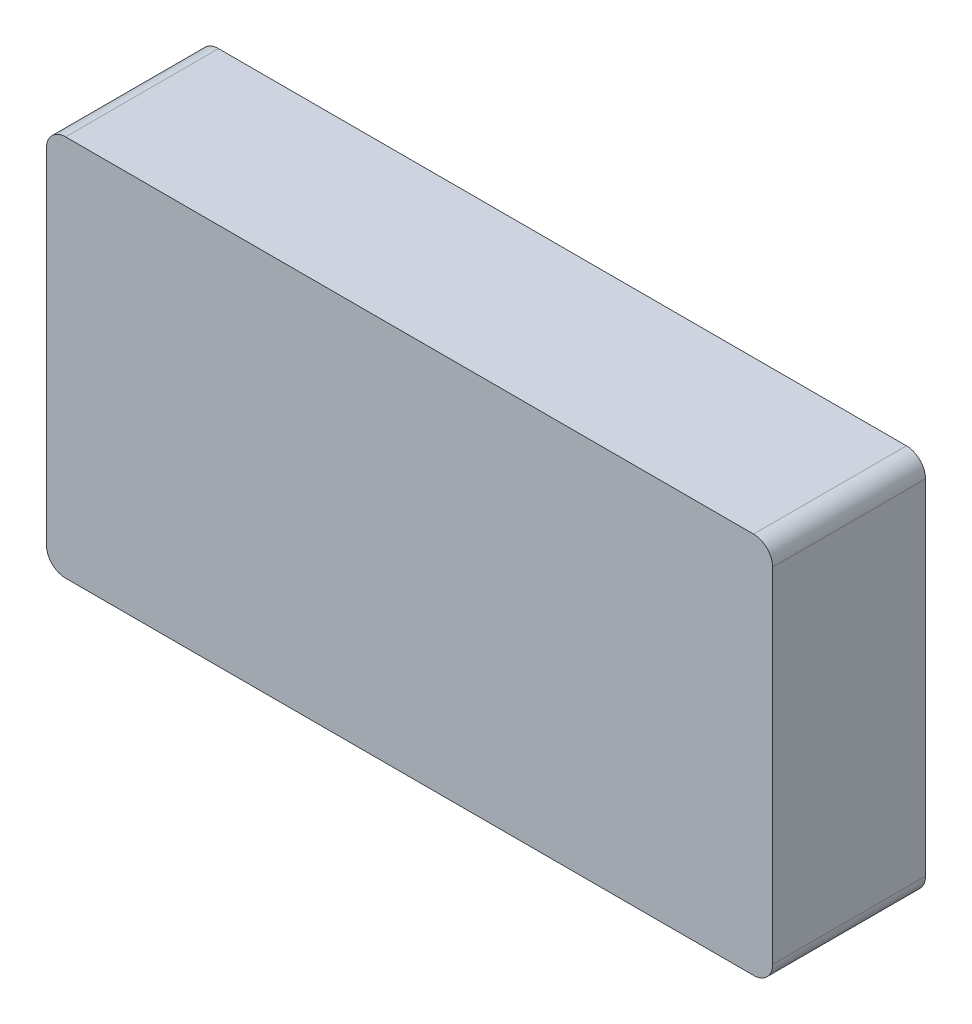
ISO-10303-21;
HEADER;
FILE_DESCRIPTION(('STEP AP214'),'2;1');
FILE_NAME('part.step','',(''),(''),'','','');
FILE_SCHEMA(('AUTOMOTIVE_DESIGN { 1 0 10303 214 1 1 1 1 }'));
ENDSEC;
DATA;
#1=APPLICATION_CONTEXT('core data for automotive mechanical design processes');
#2=APPLICATION_PROTOCOL_DEFINITION('international standard','automotive_design',2000,#1);
#3=PRODUCT_CONTEXT('',#1,'mechanical');
#4=PRODUCT('Part','Part','',(#3));
#5=PRODUCT_RELATED_PRODUCT_CATEGORY('part','',(#4));
#6=PRODUCT_DEFINITION_FORMATION('','',#4);
#7=PRODUCT_DEFINITION_CONTEXT('part definition',#1,'design');
#8=PRODUCT_DEFINITION('design','',#6,#7);
#9=PRODUCT_DEFINITION_SHAPE('','',#8);
#10=(LENGTH_UNIT() NAMED_UNIT(*) SI_UNIT(.MILLI.,.METRE.));
#11=(NAMED_UNIT(*) PLANE_ANGLE_UNIT() SI_UNIT($,.RADIAN.));
#12=(NAMED_UNIT(*) SI_UNIT($,.STERADIAN.) SOLID_ANGLE_UNIT());
#13=UNCERTAINTY_MEASURE_WITH_UNIT(LENGTH_MEASURE(1.E-05),#10,'distance_accuracy_value','');
#14=(GEOMETRIC_REPRESENTATION_CONTEXT(3) GLOBAL_UNCERTAINTY_ASSIGNED_CONTEXT((#13)) GLOBAL_UNIT_ASSIGNED_CONTEXT((#10,
#11,#12)) REPRESENTATION_CONTEXT('',''));
#15=CARTESIAN_POINT('',(0.,0.,0.));
#16=DIRECTION('',(0.,0.,1.));
#17=DIRECTION('',(1.,0.,0.));
#18=AXIS2_PLACEMENT_3D('',#15,#16,#17);
#19=CARTESIAN_POINT('',(90.,45.,40.));
#20=DIRECTION('',(0.,0.,-1.));
#21=DIRECTION('',(-1.,0.,0.));
#22=AXIS2_PLACEMENT_3D('',#19,#20,#21);
#23=PLANE('',#22);
#24=CARTESIAN_POINT('',(90.,45.,40.));
#25=DIRECTION('',(0.,0.,1.));
#26=DIRECTION('',(-1.,0.,0.));
#27=AXIS2_PLACEMENT_3D('',#24,#25,#26);
#28=CIRCLE('',#27,5.);
#29=CARTESIAN_POINT('',(95.,45.,40.));
#30=VERTEX_POINT('',#29);
#31=CARTESIAN_POINT('',(89.9999999999999,50.,40.));
#32=VERTEX_POINT('',#31);
#33=EDGE_CURVE('E189',#30,#32,#28,.T.);
#34=ORIENTED_EDGE('',*,*,#33,.T.);
#35=DIRECTION('',(-1.,0.,0.));
#36=VECTOR('',#35,1.);
#37=CARTESIAN_POINT('',(-90.,50.,40.));
#38=LINE('',#37,#36);
#39=CARTESIAN_POINT('',(-90.,50.,40.));
#40=VERTEX_POINT('',#39);
#41=EDGE_CURVE('E119',#32,#40,#38,.T.);
#42=ORIENTED_EDGE('',*,*,#41,.T.);
#43=CARTESIAN_POINT('',(-90.,45.,40.));
#44=DIRECTION('',(0.,0.,1.));
#45=DIRECTION('',(1.,0.,0.));
#46=AXIS2_PLACEMENT_3D('',#43,#44,#45);
#47=CIRCLE('',#46,5.);
#48=CARTESIAN_POINT('',(-95.,45.,40.));
#49=VERTEX_POINT('',#48);
#50=EDGE_CURVE('E210',#40,#49,#47,.T.);
#51=ORIENTED_EDGE('',*,*,#50,.T.);
#52=DIRECTION('',(0.,-1.,0.));
#53=VECTOR('',#52,1.);
#54=CARTESIAN_POINT('',(-95.,45.,40.));
#55=LINE('',#54,#53);
#56=CARTESIAN_POINT('',(-95.,-45.,40.));
#57=VERTEX_POINT('',#56);
#58=EDGE_CURVE('E223',#49,#57,#55,.T.);
#59=ORIENTED_EDGE('',*,*,#58,.T.);
#60=CARTESIAN_POINT('',(-90.,-45.,40.));
#61=DIRECTION('',(0.,0.,1.));
#62=DIRECTION('',(1.,0.,0.));
#63=AXIS2_PLACEMENT_3D('',#60,#61,#62);
#64=CIRCLE('',#63,5.);
#65=CARTESIAN_POINT('',(-90.,-50.,40.));
#66=VERTEX_POINT('',#65);
#67=EDGE_CURVE('E140',#57,#66,#64,.T.);
#68=ORIENTED_EDGE('',*,*,#67,.T.);
#69=DIRECTION('',(1.,0.,0.));
#70=VECTOR('',#69,1.);
#71=CARTESIAN_POINT('',(-90.,-50.,40.));
#72=LINE('',#71,#70);
#73=CARTESIAN_POINT('',(90.,-50.,40.));
#74=VERTEX_POINT('',#73);
#75=EDGE_CURVE('E134',#66,#74,#72,.T.);
#76=ORIENTED_EDGE('',*,*,#75,.T.);
#77=CARTESIAN_POINT('',(90.,-45.,40.));
#78=DIRECTION('',(0.,0.,1.));
#79=DIRECTION('',(1.,0.,0.));
#80=AXIS2_PLACEMENT_3D('',#77,#78,#79);
#81=CIRCLE('',#80,5.);
#82=CARTESIAN_POINT('',(95.,-45.,40.));
#83=VERTEX_POINT('',#82);
#84=EDGE_CURVE('E137',#74,#83,#81,.T.);
#85=ORIENTED_EDGE('',*,*,#84,.T.);
#86=DIRECTION('',(0.,1.,0.));
#87=VECTOR('',#86,1.);
#88=CARTESIAN_POINT('',(95.,45.,40.));
#89=LINE('',#88,#87);
#90=EDGE_CURVE('E78',#83,#30,#89,.T.);
#91=ORIENTED_EDGE('',*,*,#90,.T.);
#92=EDGE_LOOP('',(#34,#42,#51,#59,#68,#76,#85,#91));
#93=FACE_BOUND('',#92,.T.);
#94=ADVANCED_FACE('F52',(#93),#23,.F.);
#95=CARTESIAN_POINT('',(90.,45.,40.));
#96=DIRECTION('',(0.,0.,-1.));
#97=DIRECTION('',(-1.,0.,0.));
#98=AXIS2_PLACEMENT_3D('',#95,#96,#97);
#99=CYLINDRICAL_SURFACE('',#98,5.);
#100=CARTESIAN_POINT('',(90.,45.,0.));
#101=DIRECTION('',(0.,0.,1.));
#102=DIRECTION('',(-1.,0.,0.));
#103=AXIS2_PLACEMENT_3D('',#100,#101,#102);
#104=CIRCLE('',#103,5.);
#105=CARTESIAN_POINT('',(95.,45.,0.));
#106=VERTEX_POINT('',#105);
#107=CARTESIAN_POINT('',(89.9999999999999,50.,0.));
#108=VERTEX_POINT('',#107);
#109=EDGE_CURVE('E165',#106,#108,#104,.T.);
#110=ORIENTED_EDGE('',*,*,#109,.T.);
#111=DIRECTION('',(0.,0.,-1.));
#112=VECTOR('',#111,1.);
#113=CARTESIAN_POINT('',(89.9999999999999,50.,40.));
#114=LINE('',#113,#112);
#115=EDGE_CURVE('E11',#32,#108,#114,.T.);
#116=ORIENTED_EDGE('',*,*,#115,.F.);
#117=ORIENTED_EDGE('',*,*,#33,.F.);
#118=DIRECTION('',(0.,0.,-1.));
#119=VECTOR('',#118,1.);
#120=CARTESIAN_POINT('',(95.,45.,40.));
#121=LINE('',#120,#119);
#122=EDGE_CURVE('E161',#30,#106,#121,.T.);
#123=ORIENTED_EDGE('',*,*,#122,.T.);
#124=EDGE_LOOP('',(#110,#116,#117,#123));
#125=FACE_BOUND('',#124,.T.);
#126=ADVANCED_FACE('F54',(#125),#99,.T.);
#127=CARTESIAN_POINT('',(-90.,50.,40.));
#128=DIRECTION('',(0.,-1.,0.));
#129=DIRECTION('',(0.,0.,-1.));
#130=AXIS2_PLACEMENT_3D('',#127,#128,#129);
#131=PLANE('',#130);
#132=DIRECTION('',(-1.,0.,0.));
#133=VECTOR('',#132,1.);
#134=CARTESIAN_POINT('',(-90.,50.,0.));
#135=LINE('',#134,#133);
#136=CARTESIAN_POINT('',(-90.,50.,0.));
#137=VERTEX_POINT('',#136);
#138=EDGE_CURVE('E169',#108,#137,#135,.T.);
#139=ORIENTED_EDGE('',*,*,#138,.T.);
#140=DIRECTION('',(0.,0.,-1.));
#141=VECTOR('',#140,1.);
#142=CARTESIAN_POINT('',(-90.,50.,40.));
#143=LINE('',#142,#141);
#144=EDGE_CURVE('E62',#40,#137,#143,.T.);
#145=ORIENTED_EDGE('',*,*,#144,.F.);
#146=ORIENTED_EDGE('',*,*,#41,.F.);
#147=ORIENTED_EDGE('',*,*,#115,.T.);
#148=EDGE_LOOP('',(#139,#145,#146,#147));
#149=FACE_BOUND('',#148,.T.);
#150=ADVANCED_FACE('F419',(#149),#131,.F.);
#151=CARTESIAN_POINT('',(-90.,45.,40.));
#152=DIRECTION('',(0.,0.,-1.));
#153=DIRECTION('',(-1.,0.,0.));
#154=AXIS2_PLACEMENT_3D('',#151,#152,#153);
#155=CYLINDRICAL_SURFACE('',#154,5.);
#156=CARTESIAN_POINT('',(-90.,45.,0.));
#157=DIRECTION('',(0.,0.,1.));
#158=DIRECTION('',(1.,0.,0.));
#159=AXIS2_PLACEMENT_3D('',#156,#157,#158);
#160=CIRCLE('',#159,5.);
#161=CARTESIAN_POINT('',(-95.,45.,0.));
#162=VERTEX_POINT('',#161);
#163=EDGE_CURVE('E173',#137,#162,#160,.T.);
#164=ORIENTED_EDGE('',*,*,#163,.T.);
#165=DIRECTION('',(0.,0.,-1.));
#166=VECTOR('',#165,1.);
#167=CARTESIAN_POINT('',(-95.,45.,40.));
#168=LINE('',#167,#166);
#169=EDGE_CURVE('E200',#49,#162,#168,.T.);
#170=ORIENTED_EDGE('',*,*,#169,.F.);
#171=ORIENTED_EDGE('',*,*,#50,.F.);
#172=ORIENTED_EDGE('',*,*,#144,.T.);
#173=EDGE_LOOP('',(#164,#170,#171,#172));
#174=FACE_BOUND('',#173,.T.);
#175=ADVANCED_FACE('F208',(#174),#155,.T.);
#176=CARTESIAN_POINT('',(-95.,45.,40.));
#177=DIRECTION('',(1.,0.,0.));
#178=DIRECTION('',(0.,1.,0.));
#179=AXIS2_PLACEMENT_3D('',#176,#177,#178);
#180=PLANE('',#179);
#181=DIRECTION('',(0.,-1.,0.));
#182=VECTOR('',#181,1.);
#183=CARTESIAN_POINT('',(-95.,45.,0.));
#184=LINE('',#183,#182);
#185=CARTESIAN_POINT('',(-95.,-45.,0.));
#186=VERTEX_POINT('',#185);
#187=EDGE_CURVE('E176',#162,#186,#184,.T.);
#188=ORIENTED_EDGE('',*,*,#187,.T.);
#189=DIRECTION('',(0.,0.,-1.));
#190=VECTOR('',#189,1.);
#191=CARTESIAN_POINT('',(-95.,-45.,40.));
#192=LINE('',#191,#190);
#193=EDGE_CURVE('E196',#57,#186,#192,.T.);
#194=ORIENTED_EDGE('',*,*,#193,.F.);
#195=ORIENTED_EDGE('',*,*,#58,.F.);
#196=ORIENTED_EDGE('',*,*,#169,.T.);
#197=EDGE_LOOP('',(#188,#194,#195,#196));
#198=FACE_BOUND('',#197,.T.);
#199=ADVANCED_FACE('F218',(#198),#180,.F.);
#200=CARTESIAN_POINT('',(-90.,-45.,40.));
#201=DIRECTION('',(0.,0.,-1.));
#202=DIRECTION('',(-1.,0.,0.));
#203=AXIS2_PLACEMENT_3D('',#200,#201,#202);
#204=CYLINDRICAL_SURFACE('',#203,5.);
#205=CARTESIAN_POINT('',(-90.,-45.,0.));
#206=DIRECTION('',(0.,0.,1.));
#207=DIRECTION('',(1.,0.,0.));
#208=AXIS2_PLACEMENT_3D('',#205,#206,#207);
#209=CIRCLE('',#208,5.);
#210=CARTESIAN_POINT('',(-90.,-50.,0.));
#211=VERTEX_POINT('',#210);
#212=EDGE_CURVE('E179',#186,#211,#209,.T.);
#213=ORIENTED_EDGE('',*,*,#212,.T.);
#214=DIRECTION('',(0.,0.,-1.));
#215=VECTOR('',#214,1.);
#216=CARTESIAN_POINT('',(-90.,-50.,40.));
#217=LINE('',#216,#215);
#218=EDGE_CURVE('E154',#66,#211,#217,.T.);
#219=ORIENTED_EDGE('',*,*,#218,.F.);
#220=ORIENTED_EDGE('',*,*,#67,.F.);
#221=ORIENTED_EDGE('',*,*,#193,.T.);
#222=EDGE_LOOP('',(#213,#219,#220,#221));
#223=FACE_BOUND('',#222,.T.);
#224=ADVANCED_FACE('F221',(#223),#204,.T.);
#225=CARTESIAN_POINT('',(-90.,-50.,40.));
#226=DIRECTION('',(0.,1.,0.));
#227=DIRECTION('',(0.,0.,1.));
#228=AXIS2_PLACEMENT_3D('',#225,#226,#227);
#229=PLANE('',#228);
#230=DIRECTION('',(1.,0.,0.));
#231=VECTOR('',#230,1.);
#232=CARTESIAN_POINT('',(-90.,-50.,0.));
#233=LINE('',#232,#231);
#234=CARTESIAN_POINT('',(90.,-50.,0.));
#235=VERTEX_POINT('',#234);
#236=EDGE_CURVE('E150',#211,#235,#233,.T.);
#237=ORIENTED_EDGE('',*,*,#236,.T.);
#238=DIRECTION('',(0.,0.,-1.));
#239=VECTOR('',#238,1.);
#240=CARTESIAN_POINT('',(90.,-50.,40.));
#241=LINE('',#240,#239);
#242=EDGE_CURVE('E147',#74,#235,#241,.T.);
#243=ORIENTED_EDGE('',*,*,#242,.F.);
#244=ORIENTED_EDGE('',*,*,#75,.F.);
#245=ORIENTED_EDGE('',*,*,#218,.T.);
#246=EDGE_LOOP('',(#237,#243,#244,#245));
#247=FACE_BOUND('',#246,.T.);
#248=ADVANCED_FACE('F148',(#247),#229,.F.);
#249=CARTESIAN_POINT('',(90.,-45.,40.));
#250=DIRECTION('',(0.,0.,-1.));
#251=DIRECTION('',(-1.,0.,0.));
#252=AXIS2_PLACEMENT_3D('',#249,#250,#251);
#253=CYLINDRICAL_SURFACE('',#252,5.);
#254=CARTESIAN_POINT('',(90.,-45.,0.));
#255=DIRECTION('',(0.,0.,1.));
#256=DIRECTION('',(1.,0.,0.));
#257=AXIS2_PLACEMENT_3D('',#254,#255,#256);
#258=CIRCLE('',#257,5.);
#259=CARTESIAN_POINT('',(95.,-45.,0.));
#260=VERTEX_POINT('',#259);
#261=EDGE_CURVE('E184',#235,#260,#258,.T.);
#262=ORIENTED_EDGE('',*,*,#261,.T.);
#263=DIRECTION('',(0.,0.,-1.));
#264=VECTOR('',#263,1.);
#265=CARTESIAN_POINT('',(95.,-45.,40.));
#266=LINE('',#265,#264);
#267=EDGE_CURVE('E155',#83,#260,#266,.T.);
#268=ORIENTED_EDGE('',*,*,#267,.F.);
#269=ORIENTED_EDGE('',*,*,#84,.F.);
#270=ORIENTED_EDGE('',*,*,#242,.T.);
#271=EDGE_LOOP('',(#262,#268,#269,#270));
#272=FACE_BOUND('',#271,.T.);
#273=ADVANCED_FACE('F157',(#272),#253,.T.);
#274=CARTESIAN_POINT('',(95.,45.,40.));
#275=DIRECTION('',(-1.,0.,0.));
#276=DIRECTION('',(0.,-1.,0.));
#277=AXIS2_PLACEMENT_3D('',#274,#275,#276);
#278=PLANE('',#277);
#279=DIRECTION('',(0.,1.,0.));
#280=VECTOR('',#279,1.);
#281=CARTESIAN_POINT('',(95.,45.,0.));
#282=LINE('',#281,#280);
#283=EDGE_CURVE('E111',#260,#106,#282,.T.);
#284=ORIENTED_EDGE('',*,*,#283,.T.);
#285=ORIENTED_EDGE('',*,*,#122,.F.);
#286=ORIENTED_EDGE('',*,*,#90,.F.);
#287=ORIENTED_EDGE('',*,*,#267,.T.);
#288=EDGE_LOOP('',(#284,#285,#286,#287));
#289=FACE_BOUND('',#288,.T.);
#290=ADVANCED_FACE('F407',(#289),#278,.F.);
#291=CARTESIAN_POINT('',(90.,45.,0.));
#292=DIRECTION('',(0.,0.,-1.));
#293=DIRECTION('',(-1.,0.,0.));
#294=AXIS2_PLACEMENT_3D('',#291,#292,#293);
#295=PLANE('',#294);
#296=ORIENTED_EDGE('',*,*,#109,.F.);
#297=ORIENTED_EDGE('',*,*,#283,.F.);
#298=ORIENTED_EDGE('',*,*,#261,.F.);
#299=ORIENTED_EDGE('',*,*,#236,.F.);
#300=ORIENTED_EDGE('',*,*,#212,.F.);
#301=ORIENTED_EDGE('',*,*,#187,.F.);
#302=ORIENTED_EDGE('',*,*,#163,.F.);
#303=ORIENTED_EDGE('',*,*,#138,.F.);
#304=EDGE_LOOP('',(#296,#297,#298,#299,#300,#301,#302,#303));
#305=FACE_BOUND('',#304,.T.);
#306=ADVANCED_FACE('F214',(#305),#295,.T.);
#307=CLOSED_SHELL('',(#94,#126,#150,#175,#199,#224,#248,#273,#290,#306));
#308=CARTESIAN_POINT('',(90.,45.,3.));
#309=DIRECTION('',(0.,0.,-1.));
#310=DIRECTION('',(-1.,0.,0.));
#311=AXIS2_PLACEMENT_3D('',#308,#309,#310);
#312=PLANE('',#311);
#313=CARTESIAN_POINT('',(90.,45.,3.));
#314=DIRECTION('',(0.,0.,-1.));
#315=DIRECTION('',(-1.,0.,0.));
#316=AXIS2_PLACEMENT_3D('',#313,#314,#315);
#317=CIRCLE('',#316,2.);
#318=CARTESIAN_POINT('',(92.,45.,3.));
#319=VERTEX_POINT('',#318);
#320=CARTESIAN_POINT('',(89.9999999999999,47.,3.));
#321=VERTEX_POINT('',#320);
#322=EDGE_CURVE('E286',#319,#321,#317,.F.);
#323=ORIENTED_EDGE('',*,*,#322,.T.);
#324=DIRECTION('',(-1.,0.,0.));
#325=VECTOR('',#324,1.);
#326=CARTESIAN_POINT('',(90.,47.,3.));
#327=LINE('',#326,#325);
#328=CARTESIAN_POINT('',(-90.,47.,3.));
#329=VERTEX_POINT('',#328);
#330=EDGE_CURVE('E279',#321,#329,#327,.T.);
#331=ORIENTED_EDGE('',*,*,#330,.T.);
#332=CARTESIAN_POINT('',(-90.,45.,3.));
#333=DIRECTION('',(0.,0.,-1.));
#334=DIRECTION('',(-1.,0.,0.));
#335=AXIS2_PLACEMENT_3D('',#332,#333,#334);
#336=CIRCLE('',#335,2.);
#337=CARTESIAN_POINT('',(-92.,45.,3.));
#338=VERTEX_POINT('',#337);
#339=EDGE_CURVE('E271',#329,#338,#336,.F.);
#340=ORIENTED_EDGE('',*,*,#339,.T.);
#341=DIRECTION('',(0.,-1.,0.));
#342=VECTOR('',#341,1.);
#343=CARTESIAN_POINT('',(-92.,45.,3.));
#344=LINE('',#343,#342);
#345=CARTESIAN_POINT('',(-92.,-45.,3.));
#346=VERTEX_POINT('',#345);
#347=EDGE_CURVE('E263',#338,#346,#344,.T.);
#348=ORIENTED_EDGE('',*,*,#347,.T.);
#349=CARTESIAN_POINT('',(-90.,-45.,3.));
#350=DIRECTION('',(0.,0.,-1.));
#351=DIRECTION('',(-1.,0.,0.));
#352=AXIS2_PLACEMENT_3D('',#349,#350,#351);
#353=CIRCLE('',#352,2.);
#354=CARTESIAN_POINT('',(-90.,-47.,3.));
#355=VERTEX_POINT('',#354);
#356=EDGE_CURVE('E255',#346,#355,#353,.F.);
#357=ORIENTED_EDGE('',*,*,#356,.T.);
#358=DIRECTION('',(1.,0.,0.));
#359=VECTOR('',#358,1.);
#360=CARTESIAN_POINT('',(90.,-47.,3.));
#361=LINE('',#360,#359);
#362=CARTESIAN_POINT('',(90.,-47.,3.));
#363=VERTEX_POINT('',#362);
#364=EDGE_CURVE('E247',#355,#363,#361,.T.);
#365=ORIENTED_EDGE('',*,*,#364,.T.);
#366=CARTESIAN_POINT('',(90.,-45.,3.));
#367=DIRECTION('',(0.,0.,-1.));
#368=DIRECTION('',(-1.,0.,0.));
#369=AXIS2_PLACEMENT_3D('',#366,#367,#368);
#370=CIRCLE('',#369,2.);
#371=CARTESIAN_POINT('',(92.,-45.,3.));
#372=VERTEX_POINT('',#371);
#373=EDGE_CURVE('E238',#363,#372,#370,.F.);
#374=ORIENTED_EDGE('',*,*,#373,.T.);
#375=DIRECTION('',(0.,1.,0.));
#376=VECTOR('',#375,1.);
#377=CARTESIAN_POINT('',(92.,45.,3.));
#378=LINE('',#377,#376);
#379=EDGE_CURVE('E233',#372,#319,#378,.T.);
#380=ORIENTED_EDGE('',*,*,#379,.T.);
#381=EDGE_LOOP('',(#323,#331,#340,#348,#357,#365,#374,#380));
#382=FACE_BOUND('',#381,.T.);
#383=ADVANCED_FACE('F342',(#382),#312,.F.);
#384=CARTESIAN_POINT('',(92.,45.,40.));
#385=DIRECTION('',(-1.,0.,0.));
#386=DIRECTION('',(0.,-1.,0.));
#387=AXIS2_PLACEMENT_3D('',#384,#385,#386);
#388=PLANE('',#387);
#389=DIRECTION('',(0.,0.,1.));
#390=VECTOR('',#389,1.);
#391=CARTESIAN_POINT('',(92.,-45.,40.));
#392=LINE('',#391,#390);
#393=CARTESIAN_POINT('',(92.,-45.,37.));
#394=VERTEX_POINT('',#393);
#395=EDGE_CURVE('E239',#394,#372,#392,.F.);
#396=ORIENTED_EDGE('',*,*,#395,.F.);
#397=DIRECTION('',(0.,1.,0.));
#398=VECTOR('',#397,1.);
#399=CARTESIAN_POINT('',(92.,-45.,37.));
#400=LINE('',#399,#398);
#401=CARTESIAN_POINT('',(92.,45.,37.));
#402=VERTEX_POINT('',#401);
#403=EDGE_CURVE('E296',#394,#402,#400,.T.);
#404=ORIENTED_EDGE('',*,*,#403,.T.);
#405=DIRECTION('',(0.,0.,-1.));
#406=VECTOR('',#405,1.);
#407=CARTESIAN_POINT('',(92.,45.,40.));
#408=LINE('',#407,#406);
#409=EDGE_CURVE('E237',#402,#319,#408,.T.);
#410=ORIENTED_EDGE('',*,*,#409,.T.);
#411=ORIENTED_EDGE('',*,*,#379,.F.);
#412=EDGE_LOOP('',(#396,#404,#410,#411));
#413=FACE_BOUND('',#412,.T.);
#414=ADVANCED_FACE('F390',(#413),#388,.T.);
#415=CARTESIAN_POINT('',(90.,-45.,40.));
#416=DIRECTION('',(0.,0.,-1.));
#417=DIRECTION('',(-1.,0.,0.));
#418=AXIS2_PLACEMENT_3D('',#415,#416,#417);
#419=CYLINDRICAL_SURFACE('',#418,2.);
#420=DIRECTION('',(0.,0.,-1.));
#421=VECTOR('',#420,1.);
#422=CARTESIAN_POINT('',(90.,-47.,40.));
#423=LINE('',#422,#421);
#424=CARTESIAN_POINT('',(90.,-47.,37.));
#425=VERTEX_POINT('',#424);
#426=EDGE_CURVE('E243',#425,#363,#423,.T.);
#427=ORIENTED_EDGE('',*,*,#426,.F.);
#428=CARTESIAN_POINT('',(90.,-45.,37.));
#429=DIRECTION('',(0.,0.,1.));
#430=DIRECTION('',(1.,0.,0.));
#431=AXIS2_PLACEMENT_3D('',#428,#429,#430);
#432=CIRCLE('',#431,2.);
#433=EDGE_CURVE('E299',#425,#394,#432,.T.);
#434=ORIENTED_EDGE('',*,*,#433,.T.);
#435=ORIENTED_EDGE('',*,*,#395,.T.);
#436=ORIENTED_EDGE('',*,*,#373,.F.);
#437=EDGE_LOOP('',(#427,#434,#435,#436));
#438=FACE_BOUND('',#437,.T.);
#439=ADVANCED_FACE('F389',(#438),#419,.F.);
#440=CARTESIAN_POINT('',(-90.,-47.,40.));
#441=DIRECTION('',(0.,1.,0.));
#442=DIRECTION('',(0.,0.,1.));
#443=AXIS2_PLACEMENT_3D('',#440,#441,#442);
#444=PLANE('',#443);
#445=DIRECTION('',(0.,0.,1.));
#446=VECTOR('',#445,1.);
#447=CARTESIAN_POINT('',(-90.,-47.,40.));
#448=LINE('',#447,#446);
#449=CARTESIAN_POINT('',(-90.,-47.,37.));
#450=VERTEX_POINT('',#449);
#451=EDGE_CURVE('E251',#450,#355,#448,.F.);
#452=ORIENTED_EDGE('',*,*,#451,.F.);
#453=DIRECTION('',(1.,0.,0.));
#454=VECTOR('',#453,1.);
#455=CARTESIAN_POINT('',(-90.,-47.,37.));
#456=LINE('',#455,#454);
#457=EDGE_CURVE('E303',#450,#425,#456,.T.);
#458=ORIENTED_EDGE('',*,*,#457,.T.);
#459=ORIENTED_EDGE('',*,*,#426,.T.);
#460=ORIENTED_EDGE('',*,*,#364,.F.);
#461=EDGE_LOOP('',(#452,#458,#459,#460));
#462=FACE_BOUND('',#461,.T.);
#463=ADVANCED_FACE('F387',(#462),#444,.T.);
#464=CARTESIAN_POINT('',(-90.,-45.,40.));
#465=DIRECTION('',(0.,0.,-1.));
#466=DIRECTION('',(-1.,0.,0.));
#467=AXIS2_PLACEMENT_3D('',#464,#465,#466);
#468=CYLINDRICAL_SURFACE('',#467,2.);
#469=DIRECTION('',(0.,0.,-1.));
#470=VECTOR('',#469,1.);
#471=CARTESIAN_POINT('',(-92.,-45.,40.));
#472=LINE('',#471,#470);
#473=CARTESIAN_POINT('',(-92.,-45.,37.));
#474=VERTEX_POINT('',#473);
#475=EDGE_CURVE('E259',#474,#346,#472,.T.);
#476=ORIENTED_EDGE('',*,*,#475,.F.);
#477=CARTESIAN_POINT('',(-90.,-45.,37.));
#478=DIRECTION('',(0.,0.,1.));
#479=DIRECTION('',(1.,0.,0.));
#480=AXIS2_PLACEMENT_3D('',#477,#478,#479);
#481=CIRCLE('',#480,2.);
#482=EDGE_CURVE('E307',#474,#450,#481,.T.);
#483=ORIENTED_EDGE('',*,*,#482,.T.);
#484=ORIENTED_EDGE('',*,*,#451,.T.);
#485=ORIENTED_EDGE('',*,*,#356,.F.);
#486=EDGE_LOOP('',(#476,#483,#484,#485));
#487=FACE_BOUND('',#486,.T.);
#488=ADVANCED_FACE('F384',(#487),#468,.F.);
#489=CARTESIAN_POINT('',(-92.,45.,40.));
#490=DIRECTION('',(1.,0.,0.));
#491=DIRECTION('',(0.,1.,0.));
#492=AXIS2_PLACEMENT_3D('',#489,#490,#491);
#493=PLANE('',#492);
#494=DIRECTION('',(0.,0.,1.));
#495=VECTOR('',#494,1.);
#496=CARTESIAN_POINT('',(-92.,45.,40.));
#497=LINE('',#496,#495);
#498=CARTESIAN_POINT('',(-92.,45.,37.));
#499=VERTEX_POINT('',#498);
#500=EDGE_CURVE('E267',#499,#338,#497,.F.);
#501=ORIENTED_EDGE('',*,*,#500,.F.);
#502=DIRECTION('',(0.,-1.,0.));
#503=VECTOR('',#502,1.);
#504=CARTESIAN_POINT('',(-92.,45.,37.));
#505=LINE('',#504,#503);
#506=EDGE_CURVE('E311',#499,#474,#505,.T.);
#507=ORIENTED_EDGE('',*,*,#506,.T.);
#508=ORIENTED_EDGE('',*,*,#475,.T.);
#509=ORIENTED_EDGE('',*,*,#347,.F.);
#510=EDGE_LOOP('',(#501,#507,#508,#509));
#511=FACE_BOUND('',#510,.T.);
#512=ADVANCED_FACE('F379',(#511),#493,.T.);
#513=CARTESIAN_POINT('',(-90.,45.,40.));
#514=DIRECTION('',(0.,0.,-1.));
#515=DIRECTION('',(-1.,0.,0.));
#516=AXIS2_PLACEMENT_3D('',#513,#514,#515);
#517=CYLINDRICAL_SURFACE('',#516,2.);
#518=DIRECTION('',(0.,0.,-1.));
#519=VECTOR('',#518,1.);
#520=CARTESIAN_POINT('',(-90.,47.,40.));
#521=LINE('',#520,#519);
#522=CARTESIAN_POINT('',(-90.,47.,37.));
#523=VERTEX_POINT('',#522);
#524=EDGE_CURVE('E275',#523,#329,#521,.T.);
#525=ORIENTED_EDGE('',*,*,#524,.F.);
#526=CARTESIAN_POINT('',(-90.,45.,37.));
#527=DIRECTION('',(0.,0.,1.));
#528=DIRECTION('',(1.,0.,0.));
#529=AXIS2_PLACEMENT_3D('',#526,#527,#528);
#530=CIRCLE('',#529,2.);
#531=EDGE_CURVE('E315',#523,#499,#530,.T.);
#532=ORIENTED_EDGE('',*,*,#531,.T.);
#533=ORIENTED_EDGE('',*,*,#500,.T.);
#534=ORIENTED_EDGE('',*,*,#339,.F.);
#535=EDGE_LOOP('',(#525,#532,#533,#534));
#536=FACE_BOUND('',#535,.T.);
#537=ADVANCED_FACE('F376',(#536),#517,.F.);
#538=CARTESIAN_POINT('',(-90.,47.,40.));
#539=DIRECTION('',(0.,-1.,0.));
#540=DIRECTION('',(0.,0.,-1.));
#541=AXIS2_PLACEMENT_3D('',#538,#539,#540);
#542=PLANE('',#541);
#543=DIRECTION('',(0.,0.,-1.));
#544=VECTOR('',#543,1.);
#545=CARTESIAN_POINT('',(89.9999999999999,47.,40.));
#546=LINE('',#545,#544);
#547=CARTESIAN_POINT('',(89.9999999999999,47.,37.));
#548=VERTEX_POINT('',#547);
#549=EDGE_CURVE('E170',#548,#321,#546,.T.);
#550=ORIENTED_EDGE('',*,*,#549,.F.);
#551=DIRECTION('',(-1.,0.,0.));
#552=VECTOR('',#551,1.);
#553=CARTESIAN_POINT('',(89.9999999999999,47.,37.));
#554=LINE('',#553,#552);
#555=EDGE_CURVE('E319',#548,#523,#554,.T.);
#556=ORIENTED_EDGE('',*,*,#555,.T.);
#557=ORIENTED_EDGE('',*,*,#524,.T.);
#558=ORIENTED_EDGE('',*,*,#330,.F.);
#559=EDGE_LOOP('',(#550,#556,#557,#558));
#560=FACE_BOUND('',#559,.T.);
#561=ADVANCED_FACE('F335',(#560),#542,.T.);
#562=CARTESIAN_POINT('',(90.,45.,40.));
#563=DIRECTION('',(0.,0.,-1.));
#564=DIRECTION('',(-1.,0.,0.));
#565=AXIS2_PLACEMENT_3D('',#562,#563,#564);
#566=CYLINDRICAL_SURFACE('',#565,2.);
#567=ORIENTED_EDGE('',*,*,#409,.F.);
#568=CARTESIAN_POINT('',(90.,45.,37.));
#569=DIRECTION('',(0.,0.,1.));
#570=DIRECTION('',(1.,0.,0.));
#571=AXIS2_PLACEMENT_3D('',#568,#569,#570);
#572=CIRCLE('',#571,2.);
#573=EDGE_CURVE('E69',#402,#548,#572,.T.);
#574=ORIENTED_EDGE('',*,*,#573,.T.);
#575=ORIENTED_EDGE('',*,*,#549,.T.);
#576=ORIENTED_EDGE('',*,*,#322,.F.);
#577=EDGE_LOOP('',(#567,#574,#575,#576));
#578=FACE_BOUND('',#577,.T.);
#579=ADVANCED_FACE('F328',(#578),#566,.F.);
#580=CARTESIAN_POINT('',(90.,45.,37.));
#581=DIRECTION('',(0.,0.,1.));
#582=DIRECTION('',(1.,0.,0.));
#583=AXIS2_PLACEMENT_3D('',#580,#581,#582);
#584=PLANE('',#583);
#585=ORIENTED_EDGE('',*,*,#573,.F.);
#586=ORIENTED_EDGE('',*,*,#403,.F.);
#587=ORIENTED_EDGE('',*,*,#433,.F.);
#588=ORIENTED_EDGE('',*,*,#457,.F.);
#589=ORIENTED_EDGE('',*,*,#482,.F.);
#590=ORIENTED_EDGE('',*,*,#506,.F.);
#591=ORIENTED_EDGE('',*,*,#531,.F.);
#592=ORIENTED_EDGE('',*,*,#555,.F.);
#593=EDGE_LOOP('',(#585,#586,#587,#588,#589,#590,#591,#592));
#594=FACE_BOUND('',#593,.T.);
#595=ADVANCED_FACE('F373',(#594),#584,.F.);
#596=CLOSED_SHELL('',(#383,#414,#439,#463,#488,#512,#537,#561,#579,#595));
#597=ORIENTED_CLOSED_SHELL('',*,#596,.T.);
#598=BREP_WITH_VOIDS('B2',#307,(#597));
#599=ADVANCED_BREP_SHAPE_REPRESENTATION('',(#18,#598),#14);
#600=SHAPE_DEFINITION_REPRESENTATION(#9,#599);
ENDSEC;
END-ISO-10303-21;
